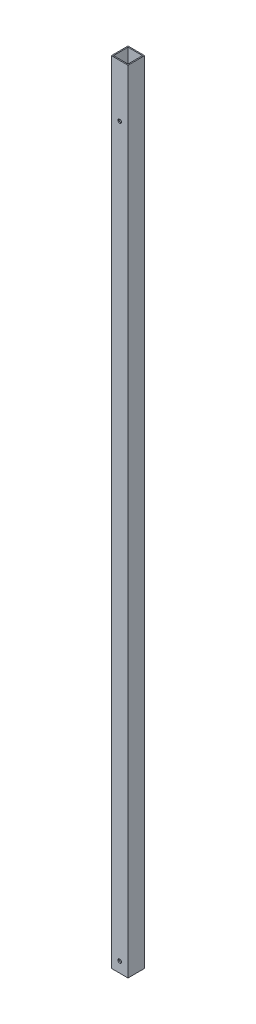
ISO-10303-21;
HEADER;
FILE_DESCRIPTION(('STEP AP214'),'2;1');
FILE_NAME('part.step','',(''),(''),'','','');
FILE_SCHEMA(('AUTOMOTIVE_DESIGN { 1 0 10303 214 1 1 1 1 }'));
ENDSEC;
DATA;
#1=APPLICATION_CONTEXT('core data for automotive mechanical design processes');
#2=APPLICATION_PROTOCOL_DEFINITION('international standard','automotive_design',2000,#1);
#3=PRODUCT_CONTEXT('',#1,'mechanical');
#4=PRODUCT('Part','Part','',(#3));
#5=PRODUCT_RELATED_PRODUCT_CATEGORY('part','',(#4));
#6=PRODUCT_DEFINITION_FORMATION('','',#4);
#7=PRODUCT_DEFINITION_CONTEXT('part definition',#1,'design');
#8=PRODUCT_DEFINITION('design','',#6,#7);
#9=PRODUCT_DEFINITION_SHAPE('','',#8);
#10=(LENGTH_UNIT() NAMED_UNIT(*) SI_UNIT(.MILLI.,.METRE.));
#11=(NAMED_UNIT(*) PLANE_ANGLE_UNIT() SI_UNIT($,.RADIAN.));
#12=(NAMED_UNIT(*) SI_UNIT($,.STERADIAN.) SOLID_ANGLE_UNIT());
#13=UNCERTAINTY_MEASURE_WITH_UNIT(LENGTH_MEASURE(1.E-05),#10,'distance_accuracy_value','');
#14=(GEOMETRIC_REPRESENTATION_CONTEXT(3) GLOBAL_UNCERTAINTY_ASSIGNED_CONTEXT((#13)) GLOBAL_UNIT_ASSIGNED_CONTEXT((#10,
#11,#12)) REPRESENTATION_CONTEXT('',''));
#15=CARTESIAN_POINT('',(0.,0.,0.));
#16=DIRECTION('',(0.,0.,1.));
#17=DIRECTION('',(1.,0.,0.));
#18=AXIS2_PLACEMENT_3D('',#15,#16,#17);
#19=CARTESIAN_POINT('',(0.,750.,0.));
#20=DIRECTION('',(0.,-1.,0.));
#21=DIRECTION('',(0.,0.,-1.));
#22=AXIS2_PLACEMENT_3D('',#19,#20,#21);
#23=PLANE('',#22);
#24=DIRECTION('',(0.,0.,-1.));
#25=VECTOR('',#24,1.);
#26=CARTESIAN_POINT('',(7.89999999997326,750.,7.89999999997326));
#27=LINE('',#26,#25);
#28=CARTESIAN_POINT('',(7.89999999997326,750.,7.89999999997326));
#29=VERTEX_POINT('',#28);
#30=CARTESIAN_POINT('',(7.89999999997326,750.,-7.89999999997326));
#31=VERTEX_POINT('',#30);
#32=EDGE_CURVE('E142',#29,#31,#27,.T.);
#33=ORIENTED_EDGE('',*,*,#32,.T.);
#34=DIRECTION('',(-1.,0.,0.));
#35=VECTOR('',#34,1.);
#36=CARTESIAN_POINT('',(-7.89999999997326,750.,-7.89999999997326));
#37=LINE('',#36,#35);
#38=CARTESIAN_POINT('',(-7.89999999997326,750.,-7.89999999997326));
#39=VERTEX_POINT('',#38);
#40=EDGE_CURVE('E145',#31,#39,#37,.T.);
#41=ORIENTED_EDGE('',*,*,#40,.T.);
#42=DIRECTION('',(0.,0.,1.));
#43=VECTOR('',#42,1.);
#44=CARTESIAN_POINT('',(-7.89999999997326,750.,7.89999999997326));
#45=LINE('',#44,#43);
#46=CARTESIAN_POINT('',(-7.89999999997326,750.,7.89999999997326));
#47=VERTEX_POINT('',#46);
#48=EDGE_CURVE('E148',#39,#47,#45,.T.);
#49=ORIENTED_EDGE('',*,*,#48,.T.);
#50=DIRECTION('',(1.,0.,0.));
#51=VECTOR('',#50,1.);
#52=CARTESIAN_POINT('',(-7.89999999997326,750.,7.89999999997326));
#53=LINE('',#52,#51);
#54=EDGE_CURVE('E150',#47,#29,#53,.T.);
#55=ORIENTED_EDGE('',*,*,#54,.T.);
#56=EDGE_LOOP('',(#33,#41,#49,#55));
#57=FACE_BOUND('',#56,.T.);
#58=DIRECTION('',(1.,0.,0.));
#59=VECTOR('',#58,1.);
#60=CARTESIAN_POINT('',(-6.89999999997326,750.,6.89999999997326));
#61=LINE('',#60,#59);
#62=CARTESIAN_POINT('',(-6.89999999997326,750.,6.89999999997326));
#63=VERTEX_POINT('',#62);
#64=CARTESIAN_POINT('',(6.89999999997326,750.,6.89999999997326));
#65=VERTEX_POINT('',#64);
#66=EDGE_CURVE('E104',#63,#65,#61,.T.);
#67=ORIENTED_EDGE('',*,*,#66,.F.);
#68=DIRECTION('',(0.,0.,1.));
#69=VECTOR('',#68,1.);
#70=CARTESIAN_POINT('',(-6.89999999997326,750.,6.89999999997326));
#71=LINE('',#70,#69);
#72=CARTESIAN_POINT('',(-6.89999999997326,750.,-6.89999999997326));
#73=VERTEX_POINT('',#72);
#74=EDGE_CURVE('E126',#73,#63,#71,.T.);
#75=ORIENTED_EDGE('',*,*,#74,.F.);
#76=DIRECTION('',(-1.,0.,0.));
#77=VECTOR('',#76,1.);
#78=CARTESIAN_POINT('',(-6.89999999997326,750.,-6.89999999997326));
#79=LINE('',#78,#77);
#80=CARTESIAN_POINT('',(6.89999999997326,750.,-6.89999999997326));
#81=VERTEX_POINT('',#80);
#82=EDGE_CURVE('E124',#81,#73,#79,.T.);
#83=ORIENTED_EDGE('',*,*,#82,.F.);
#84=DIRECTION('',(0.,0.,-1.));
#85=VECTOR('',#84,1.);
#86=CARTESIAN_POINT('',(6.89999999997326,750.,6.89999999997326));
#87=LINE('',#86,#85);
#88=EDGE_CURVE('E112',#65,#81,#87,.T.);
#89=ORIENTED_EDGE('',*,*,#88,.F.);
#90=EDGE_LOOP('',(#67,#75,#83,#89));
#91=FACE_BOUND('',#90,.T.);
#92=ADVANCED_FACE('F37',(#57,#91),#23,.F.);
#93=CARTESIAN_POINT('',(0.,0.,0.));
#94=DIRECTION('',(0.,-1.,0.));
#95=DIRECTION('',(0.,0.,-1.));
#96=AXIS2_PLACEMENT_3D('',#93,#94,#95);
#97=PLANE('',#96);
#98=DIRECTION('',(0.,0.,-1.));
#99=VECTOR('',#98,1.);
#100=CARTESIAN_POINT('',(7.89999999997326,0.,7.89999999997326));
#101=LINE('',#100,#99);
#102=CARTESIAN_POINT('',(7.89999999997326,0.,7.89999999997326));
#103=VERTEX_POINT('',#102);
#104=CARTESIAN_POINT('',(7.89999999997326,0.,-7.89999999997326));
#105=VERTEX_POINT('',#104);
#106=EDGE_CURVE('E120',#103,#105,#101,.T.);
#107=ORIENTED_EDGE('',*,*,#106,.F.);
#108=DIRECTION('',(1.,0.,0.));
#109=VECTOR('',#108,1.);
#110=CARTESIAN_POINT('',(-7.89999999997326,0.,7.89999999997326));
#111=LINE('',#110,#109);
#112=CARTESIAN_POINT('',(-7.89999999997326,0.,7.89999999997326));
#113=VERTEX_POINT('',#112);
#114=EDGE_CURVE('E146',#113,#103,#111,.T.);
#115=ORIENTED_EDGE('',*,*,#114,.F.);
#116=DIRECTION('',(0.,0.,1.));
#117=VECTOR('',#116,1.);
#118=CARTESIAN_POINT('',(-7.89999999997326,0.,7.89999999997326));
#119=LINE('',#118,#117);
#120=CARTESIAN_POINT('',(-7.89999999997326,0.,-7.89999999997326));
#121=VERTEX_POINT('',#120);
#122=EDGE_CURVE('E157',#121,#113,#119,.T.);
#123=ORIENTED_EDGE('',*,*,#122,.F.);
#124=DIRECTION('',(-1.,0.,0.));
#125=VECTOR('',#124,1.);
#126=CARTESIAN_POINT('',(-7.89999999997326,0.,-7.89999999997326));
#127=LINE('',#126,#125);
#128=EDGE_CURVE('E155',#105,#121,#127,.T.);
#129=ORIENTED_EDGE('',*,*,#128,.F.);
#130=EDGE_LOOP('',(#107,#115,#123,#129));
#131=FACE_BOUND('',#130,.T.);
#132=DIRECTION('',(0.,0.,1.));
#133=VECTOR('',#132,1.);
#134=CARTESIAN_POINT('',(-6.89999999997326,0.,6.89999999997326));
#135=LINE('',#134,#133);
#136=CARTESIAN_POINT('',(-6.89999999997326,0.,-6.89999999997326));
#137=VERTEX_POINT('',#136);
#138=CARTESIAN_POINT('',(-6.89999999997326,0.,6.89999999997326));
#139=VERTEX_POINT('',#138);
#140=EDGE_CURVE('E113',#137,#139,#135,.T.);
#141=ORIENTED_EDGE('',*,*,#140,.T.);
#142=DIRECTION('',(1.,0.,0.));
#143=VECTOR('',#142,1.);
#144=CARTESIAN_POINT('',(-6.89999999997326,0.,6.89999999997326));
#145=LINE('',#144,#143);
#146=CARTESIAN_POINT('',(6.89999999997326,0.,6.89999999997326));
#147=VERTEX_POINT('',#146);
#148=EDGE_CURVE('E62',#139,#147,#145,.T.);
#149=ORIENTED_EDGE('',*,*,#148,.T.);
#150=DIRECTION('',(0.,0.,-1.));
#151=VECTOR('',#150,1.);
#152=CARTESIAN_POINT('',(6.89999999997326,0.,6.89999999997326));
#153=LINE('',#152,#151);
#154=CARTESIAN_POINT('',(6.89999999997326,0.,-6.89999999997326));
#155=VERTEX_POINT('',#154);
#156=EDGE_CURVE('E119',#147,#155,#153,.T.);
#157=ORIENTED_EDGE('',*,*,#156,.T.);
#158=DIRECTION('',(-1.,0.,0.));
#159=VECTOR('',#158,1.);
#160=CARTESIAN_POINT('',(-6.89999999997326,0.,-6.89999999997326));
#161=LINE('',#160,#159);
#162=EDGE_CURVE('E134',#155,#137,#161,.T.);
#163=ORIENTED_EDGE('',*,*,#162,.T.);
#164=EDGE_LOOP('',(#141,#149,#157,#163));
#165=FACE_BOUND('',#164,.T.);
#166=ADVANCED_FACE('F204',(#131,#165),#97,.T.);
#167=CARTESIAN_POINT('',(7.89999999997326,750.,7.89999999997326));
#168=DIRECTION('',(-1.,0.,0.));
#169=DIRECTION('',(0.,0.,1.));
#170=AXIS2_PLACEMENT_3D('',#167,#168,#169);
#171=PLANE('',#170);
#172=ORIENTED_EDGE('',*,*,#106,.T.);
#173=DIRECTION('',(0.,-1.,0.));
#174=VECTOR('',#173,1.);
#175=CARTESIAN_POINT('',(7.89999999997326,750.,-7.89999999997326));
#176=LINE('',#175,#174);
#177=EDGE_CURVE('E11',#31,#105,#176,.T.);
#178=ORIENTED_EDGE('',*,*,#177,.F.);
#179=ORIENTED_EDGE('',*,*,#32,.F.);
#180=DIRECTION('',(0.,-1.,0.));
#181=VECTOR('',#180,1.);
#182=CARTESIAN_POINT('',(7.89999999997326,750.,7.89999999997326));
#183=LINE('',#182,#181);
#184=EDGE_CURVE('E152',#29,#103,#183,.T.);
#185=ORIENTED_EDGE('',*,*,#184,.T.);
#186=EDGE_LOOP('',(#172,#178,#179,#185));
#187=FACE_BOUND('',#186,.T.);
#188=ADVANCED_FACE('F39',(#187),#171,.F.);
#189=CARTESIAN_POINT('',(-7.89999999997326,750.,-7.89999999997326));
#190=DIRECTION('',(0.,0.,1.));
#191=DIRECTION('',(1.,0.,0.));
#192=AXIS2_PLACEMENT_3D('',#189,#190,#191);
#193=PLANE('',#192);
#194=CARTESIAN_POINT('',(0.,700.,-7.89999999997326));
#195=DIRECTION('',(0.,0.,1.));
#196=DIRECTION('',(1.,0.,0.));
#197=AXIS2_PLACEMENT_3D('',#194,#195,#196);
#198=CIRCLE('',#197,1.69999999999999);
#199=CARTESIAN_POINT('',(1.7,700.,-7.89999999997326));
#200=VERTEX_POINT('',#199);
#201=EDGE_CURVE('E169',#200,#200,#198,.T.);
#202=ORIENTED_EDGE('',*,*,#201,.T.);
#203=EDGE_LOOP('',(#202));
#204=FACE_BOUND('',#203,.T.);
#205=CARTESIAN_POINT('',(0.,10.,-7.89999999997326));
#206=DIRECTION('',(0.,0.,1.));
#207=DIRECTION('',(-1.,0.,0.));
#208=AXIS2_PLACEMENT_3D('',#205,#206,#207);
#209=CIRCLE('',#208,1.7);
#210=CARTESIAN_POINT('',(-1.7,10.,-7.89999999997326));
#211=VERTEX_POINT('',#210);
#212=EDGE_CURVE('E185',#211,#211,#209,.T.);
#213=ORIENTED_EDGE('',*,*,#212,.T.);
#214=EDGE_LOOP('',(#213));
#215=FACE_BOUND('',#214,.T.);
#216=ORIENTED_EDGE('',*,*,#128,.T.);
#217=DIRECTION('',(0.,-1.,0.));
#218=VECTOR('',#217,1.);
#219=CARTESIAN_POINT('',(-7.89999999997326,750.,-7.89999999997326));
#220=LINE('',#219,#218);
#221=EDGE_CURVE('E46',#39,#121,#220,.T.);
#222=ORIENTED_EDGE('',*,*,#221,.F.);
#223=ORIENTED_EDGE('',*,*,#40,.F.);
#224=ORIENTED_EDGE('',*,*,#177,.T.);
#225=EDGE_LOOP('',(#216,#222,#223,#224));
#226=FACE_BOUND('',#225,.T.);
#227=ADVANCED_FACE('F230',(#204,#215,#226),#193,.F.);
#228=CARTESIAN_POINT('',(-7.89999999997326,750.,7.89999999997326));
#229=DIRECTION('',(1.,0.,0.));
#230=DIRECTION('',(0.,0.,-1.));
#231=AXIS2_PLACEMENT_3D('',#228,#229,#230);
#232=PLANE('',#231);
#233=ORIENTED_EDGE('',*,*,#122,.T.);
#234=DIRECTION('',(0.,-1.,0.));
#235=VECTOR('',#234,1.);
#236=CARTESIAN_POINT('',(-7.89999999997326,750.,7.89999999997326));
#237=LINE('',#236,#235);
#238=EDGE_CURVE('E162',#47,#113,#237,.T.);
#239=ORIENTED_EDGE('',*,*,#238,.F.);
#240=ORIENTED_EDGE('',*,*,#48,.F.);
#241=ORIENTED_EDGE('',*,*,#221,.T.);
#242=EDGE_LOOP('',(#233,#239,#240,#241));
#243=FACE_BOUND('',#242,.T.);
#244=ADVANCED_FACE('F227',(#243),#232,.F.);
#245=CARTESIAN_POINT('',(-7.89999999997326,750.,7.89999999997326));
#246=DIRECTION('',(0.,0.,-1.));
#247=DIRECTION('',(-1.,0.,0.));
#248=AXIS2_PLACEMENT_3D('',#245,#246,#247);
#249=PLANE('',#248);
#250=CARTESIAN_POINT('',(0.,700.,7.89999999997326));
#251=DIRECTION('',(0.,0.,1.));
#252=DIRECTION('',(1.,0.,0.));
#253=AXIS2_PLACEMENT_3D('',#250,#251,#252);
#254=CIRCLE('',#253,1.69999999999999);
#255=CARTESIAN_POINT('',(1.7,700.,7.89999999997326));
#256=VERTEX_POINT('',#255);
#257=EDGE_CURVE('E175',#256,#256,#254,.T.);
#258=ORIENTED_EDGE('',*,*,#257,.F.);
#259=EDGE_LOOP('',(#258));
#260=FACE_BOUND('',#259,.T.);
#261=CARTESIAN_POINT('',(0.,10.,7.89999999997326));
#262=DIRECTION('',(0.,0.,1.));
#263=DIRECTION('',(-1.,0.,0.));
#264=AXIS2_PLACEMENT_3D('',#261,#262,#263);
#265=CIRCLE('',#264,1.7);
#266=CARTESIAN_POINT('',(-1.7,10.,7.89999999997326));
#267=VERTEX_POINT('',#266);
#268=EDGE_CURVE('E180',#267,#267,#265,.T.);
#269=ORIENTED_EDGE('',*,*,#268,.F.);
#270=EDGE_LOOP('',(#269));
#271=FACE_BOUND('',#270,.T.);
#272=ORIENTED_EDGE('',*,*,#114,.T.);
#273=ORIENTED_EDGE('',*,*,#184,.F.);
#274=ORIENTED_EDGE('',*,*,#54,.F.);
#275=ORIENTED_EDGE('',*,*,#238,.T.);
#276=EDGE_LOOP('',(#272,#273,#274,#275));
#277=FACE_BOUND('',#276,.T.);
#278=ADVANCED_FACE('F224',(#260,#271,#277),#249,.F.);
#279=CARTESIAN_POINT('',(-6.89999999997326,750.,6.89999999997326));
#280=DIRECTION('',(0.,0.,-1.));
#281=DIRECTION('',(-1.,0.,0.));
#282=AXIS2_PLACEMENT_3D('',#279,#280,#281);
#283=PLANE('',#282);
#284=CARTESIAN_POINT('',(0.,700.,6.89999999997326));
#285=DIRECTION('',(0.,0.,-1.));
#286=DIRECTION('',(-1.,0.,0.));
#287=AXIS2_PLACEMENT_3D('',#284,#285,#286);
#288=CIRCLE('',#287,1.69999999999999);
#289=CARTESIAN_POINT('',(-1.69999999999999,700.,6.89999999997326));
#290=VERTEX_POINT('',#289);
#291=EDGE_CURVE('E132',#290,#290,#288,.T.);
#292=ORIENTED_EDGE('',*,*,#291,.F.);
#293=EDGE_LOOP('',(#292));
#294=FACE_BOUND('',#293,.T.);
#295=CARTESIAN_POINT('',(0.,10.,6.89999999997326));
#296=DIRECTION('',(0.,0.,-1.));
#297=DIRECTION('',(-1.,0.,0.));
#298=AXIS2_PLACEMENT_3D('',#295,#296,#297);
#299=CIRCLE('',#298,1.7);
#300=CARTESIAN_POINT('',(-1.7,10.,6.89999999997326));
#301=VERTEX_POINT('',#300);
#302=EDGE_CURVE('E168',#301,#301,#299,.T.);
#303=ORIENTED_EDGE('',*,*,#302,.F.);
#304=EDGE_LOOP('',(#303));
#305=FACE_BOUND('',#304,.T.);
#306=ORIENTED_EDGE('',*,*,#148,.F.);
#307=DIRECTION('',(0.,-1.,0.));
#308=VECTOR('',#307,1.);
#309=CARTESIAN_POINT('',(-6.89999999997326,750.,6.89999999997326));
#310=LINE('',#309,#308);
#311=EDGE_CURVE('E108',#63,#139,#310,.T.);
#312=ORIENTED_EDGE('',*,*,#311,.F.);
#313=ORIENTED_EDGE('',*,*,#66,.T.);
#314=DIRECTION('',(0.,-1.,0.));
#315=VECTOR('',#314,1.);
#316=CARTESIAN_POINT('',(6.89999999997326,750.,6.89999999997326));
#317=LINE('',#316,#315);
#318=EDGE_CURVE('E107',#65,#147,#317,.T.);
#319=ORIENTED_EDGE('',*,*,#318,.T.);
#320=EDGE_LOOP('',(#306,#312,#313,#319));
#321=FACE_BOUND('',#320,.T.);
#322=ADVANCED_FACE('F106',(#294,#305,#321),#283,.T.);
#323=CARTESIAN_POINT('',(6.89999999997326,750.,6.89999999997326));
#324=DIRECTION('',(-1.,0.,0.));
#325=DIRECTION('',(0.,0.,1.));
#326=AXIS2_PLACEMENT_3D('',#323,#324,#325);
#327=PLANE('',#326);
#328=ORIENTED_EDGE('',*,*,#156,.F.);
#329=ORIENTED_EDGE('',*,*,#318,.F.);
#330=ORIENTED_EDGE('',*,*,#88,.T.);
#331=DIRECTION('',(0.,-1.,0.));
#332=VECTOR('',#331,1.);
#333=CARTESIAN_POINT('',(6.89999999997326,750.,-6.89999999997326));
#334=LINE('',#333,#332);
#335=EDGE_CURVE('E121',#81,#155,#334,.T.);
#336=ORIENTED_EDGE('',*,*,#335,.T.);
#337=EDGE_LOOP('',(#328,#329,#330,#336));
#338=FACE_BOUND('',#337,.T.);
#339=ADVANCED_FACE('F116',(#338),#327,.T.);
#340=CARTESIAN_POINT('',(-6.89999999997326,750.,-6.89999999997326));
#341=DIRECTION('',(0.,0.,1.));
#342=DIRECTION('',(1.,0.,0.));
#343=AXIS2_PLACEMENT_3D('',#340,#341,#342);
#344=PLANE('',#343);
#345=CARTESIAN_POINT('',(0.,700.,-6.89999999997326));
#346=DIRECTION('',(0.,0.,1.));
#347=DIRECTION('',(1.,0.,0.));
#348=AXIS2_PLACEMENT_3D('',#345,#346,#347);
#349=CIRCLE('',#348,1.69999999999999);
#350=CARTESIAN_POINT('',(1.7,700.,-6.89999999997326));
#351=VERTEX_POINT('',#350);
#352=EDGE_CURVE('E41',#351,#351,#349,.T.);
#353=ORIENTED_EDGE('',*,*,#352,.F.);
#354=EDGE_LOOP('',(#353));
#355=FACE_BOUND('',#354,.T.);
#356=CARTESIAN_POINT('',(0.,10.,-6.89999999997326));
#357=DIRECTION('',(0.,0.,1.));
#358=DIRECTION('',(1.,0.,0.));
#359=AXIS2_PLACEMENT_3D('',#356,#357,#358);
#360=CIRCLE('',#359,1.7);
#361=CARTESIAN_POINT('',(1.7,10.,-6.89999999997326));
#362=VERTEX_POINT('',#361);
#363=EDGE_CURVE('E166',#362,#362,#360,.T.);
#364=ORIENTED_EDGE('',*,*,#363,.F.);
#365=EDGE_LOOP('',(#364));
#366=FACE_BOUND('',#365,.T.);
#367=ORIENTED_EDGE('',*,*,#162,.F.);
#368=ORIENTED_EDGE('',*,*,#335,.F.);
#369=ORIENTED_EDGE('',*,*,#82,.T.);
#370=DIRECTION('',(0.,-1.,0.));
#371=VECTOR('',#370,1.);
#372=CARTESIAN_POINT('',(-6.89999999997326,750.,-6.89999999997326));
#373=LINE('',#372,#371);
#374=EDGE_CURVE('E54',#73,#137,#373,.T.);
#375=ORIENTED_EDGE('',*,*,#374,.T.);
#376=EDGE_LOOP('',(#367,#368,#369,#375));
#377=FACE_BOUND('',#376,.T.);
#378=ADVANCED_FACE('F196',(#355,#366,#377),#344,.T.);
#379=CARTESIAN_POINT('',(-6.89999999997326,750.,6.89999999997326));
#380=DIRECTION('',(1.,0.,0.));
#381=DIRECTION('',(0.,0.,-1.));
#382=AXIS2_PLACEMENT_3D('',#379,#380,#381);
#383=PLANE('',#382);
#384=ORIENTED_EDGE('',*,*,#140,.F.);
#385=ORIENTED_EDGE('',*,*,#374,.F.);
#386=ORIENTED_EDGE('',*,*,#74,.T.);
#387=ORIENTED_EDGE('',*,*,#311,.T.);
#388=EDGE_LOOP('',(#384,#385,#386,#387));
#389=FACE_BOUND('',#388,.T.);
#390=ADVANCED_FACE('F199',(#389),#383,.T.);
#391=CARTESIAN_POINT('',(0.,10.,-7.89999999997326));
#392=DIRECTION('',(0.,0.,1.));
#393=DIRECTION('',(1.,0.,0.));
#394=AXIS2_PLACEMENT_3D('',#391,#392,#393);
#395=CYLINDRICAL_SURFACE('',#394,1.7);
#396=ORIENTED_EDGE('',*,*,#363,.T.);
#397=EDGE_LOOP('',(#396));
#398=FACE_BOUND('',#397,.T.);
#399=ORIENTED_EDGE('',*,*,#212,.F.);
#400=EDGE_LOOP('',(#399));
#401=FACE_BOUND('',#400,.T.);
#402=ADVANCED_FACE('F206',(#398,#401),#395,.F.);
#403=CARTESIAN_POINT('',(0.,700.,-7.89999999997326));
#404=DIRECTION('',(0.,0.,1.));
#405=DIRECTION('',(1.,0.,0.));
#406=AXIS2_PLACEMENT_3D('',#403,#404,#405);
#407=CYLINDRICAL_SURFACE('',#406,1.69999999999999);
#408=ORIENTED_EDGE('',*,*,#352,.T.);
#409=EDGE_LOOP('',(#408));
#410=FACE_BOUND('',#409,.T.);
#411=ORIENTED_EDGE('',*,*,#201,.F.);
#412=EDGE_LOOP('',(#411));
#413=FACE_BOUND('',#412,.T.);
#414=ADVANCED_FACE('F193',(#410,#413),#407,.F.);
#415=ORIENTED_EDGE('',*,*,#302,.T.);
#416=EDGE_LOOP('',(#415));
#417=FACE_BOUND('',#416,.T.);
#418=ORIENTED_EDGE('',*,*,#268,.T.);
#419=EDGE_LOOP('',(#418));
#420=FACE_BOUND('',#419,.T.);
#421=ADVANCED_FACE('F212',(#417,#420),#395,.F.);
#422=ORIENTED_EDGE('',*,*,#291,.T.);
#423=EDGE_LOOP('',(#422));
#424=FACE_BOUND('',#423,.T.);
#425=ORIENTED_EDGE('',*,*,#257,.T.);
#426=EDGE_LOOP('',(#425));
#427=FACE_BOUND('',#426,.T.);
#428=ADVANCED_FACE('F329',(#424,#427),#407,.F.);
#429=CLOSED_SHELL('',(#92,#166,#188,#227,#244,#278,#322,#339,#378,#390,#402,#414,#421,#428));
#430=MANIFOLD_SOLID_BREP('B2',#429);
#431=ADVANCED_BREP_SHAPE_REPRESENTATION('',(#18,#430),#14);
#432=SHAPE_DEFINITION_REPRESENTATION(#9,#431);
ENDSEC;
END-ISO-10303-21;
